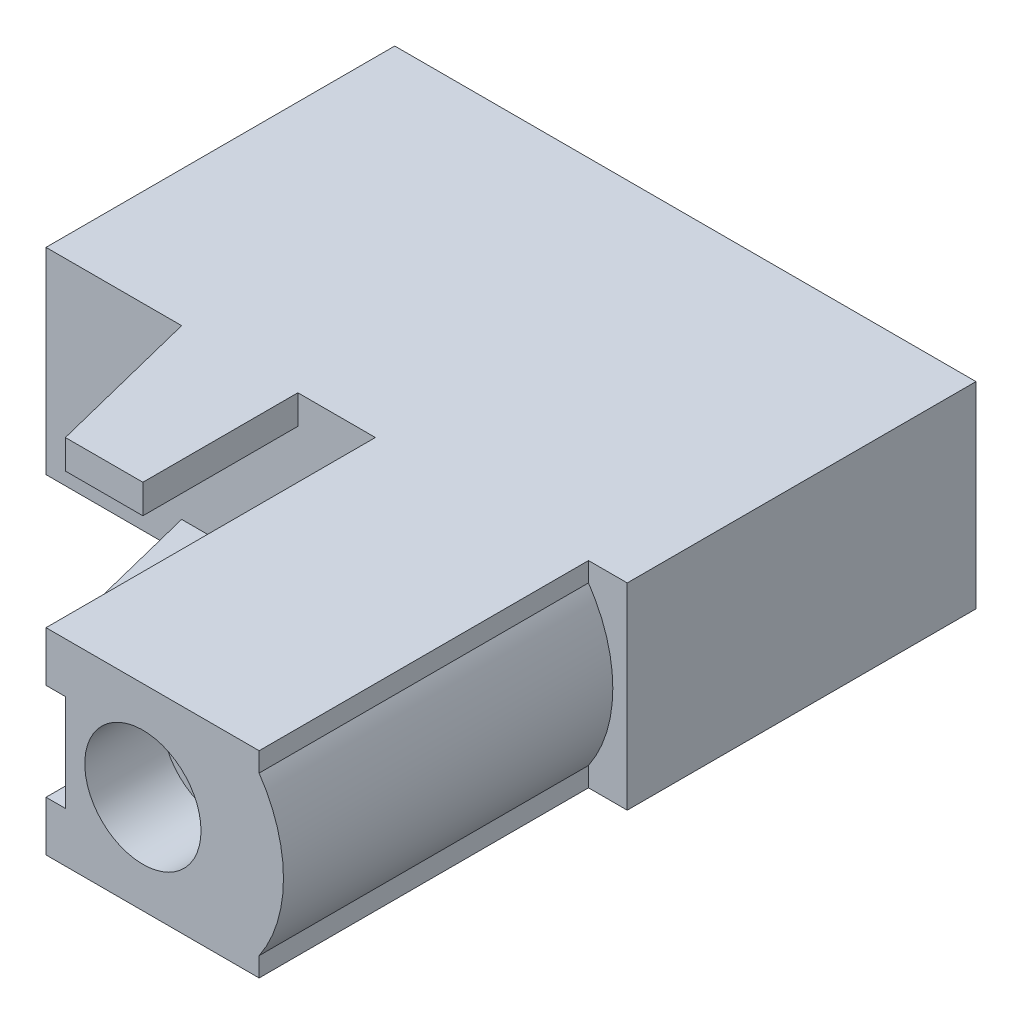
ISO-10303-21;
HEADER;
FILE_DESCRIPTION(('STEP AP214'),'2;1');
FILE_NAME('part.step','',(''),(''),'','','');
FILE_SCHEMA(('AUTOMOTIVE_DESIGN { 1 0 10303 214 1 1 1 1 }'));
ENDSEC;
DATA;
#1=APPLICATION_CONTEXT('core data for automotive mechanical design processes');
#2=APPLICATION_PROTOCOL_DEFINITION('international standard','automotive_design',2000,#1);
#3=PRODUCT_CONTEXT('',#1,'mechanical');
#4=PRODUCT('Part','Part','',(#3));
#5=PRODUCT_RELATED_PRODUCT_CATEGORY('part','',(#4));
#6=PRODUCT_DEFINITION_FORMATION('','',#4);
#7=PRODUCT_DEFINITION_CONTEXT('part definition',#1,'design');
#8=PRODUCT_DEFINITION('design','',#6,#7);
#9=PRODUCT_DEFINITION_SHAPE('','',#8);
#10=(LENGTH_UNIT() NAMED_UNIT(*) SI_UNIT(.MILLI.,.METRE.));
#11=(NAMED_UNIT(*) PLANE_ANGLE_UNIT() SI_UNIT($,.RADIAN.));
#12=(NAMED_UNIT(*) SI_UNIT($,.STERADIAN.) SOLID_ANGLE_UNIT());
#13=UNCERTAINTY_MEASURE_WITH_UNIT(LENGTH_MEASURE(1.E-05),#10,'distance_accuracy_value','');
#14=(GEOMETRIC_REPRESENTATION_CONTEXT(3) GLOBAL_UNCERTAINTY_ASSIGNED_CONTEXT((#13)) GLOBAL_UNIT_ASSIGNED_CONTEXT((#10,
#11,#12)) REPRESENTATION_CONTEXT('',''));
#15=CARTESIAN_POINT('',(0.,0.,0.));
#16=DIRECTION('',(0.,0.,1.));
#17=DIRECTION('',(1.,0.,0.));
#18=AXIS2_PLACEMENT_3D('',#15,#16,#17);
#19=CARTESIAN_POINT('',(0.,0.,9.));
#20=DIRECTION('',(0.,0.,1.));
#21=DIRECTION('',(1.,0.,0.));
#22=AXIS2_PLACEMENT_3D('',#19,#20,#21);
#23=PLANE('',#22);
#24=DIRECTION('',(-1.,0.,0.));
#25=VECTOR('',#24,1.);
#26=CARTESIAN_POINT('',(-7.5,2.54,9.));
#27=LINE('',#26,#25);
#28=CARTESIAN_POINT('',(0.999999999999992,2.54,9.));
#29=VERTEX_POINT('',#28);
#30=CARTESIAN_POINT('',(-1.,2.54,9.));
#31=VERTEX_POINT('',#30);
#32=EDGE_CURVE('E346',#29,#31,#27,.T.);
#33=ORIENTED_EDGE('',*,*,#32,.T.);
#34=DIRECTION('',(0.,-1.,0.));
#35=VECTOR('',#34,1.);
#36=CARTESIAN_POINT('',(-1.,0.,9.));
#37=LINE('',#36,#35);
#38=CARTESIAN_POINT('',(-1.,1.79,9.));
#39=VERTEX_POINT('',#38);
#40=EDGE_CURVE('E52',#31,#39,#37,.T.);
#41=ORIENTED_EDGE('',*,*,#40,.T.);
#42=DIRECTION('',(1.,0.,0.));
#43=VECTOR('',#42,1.);
#44=CARTESIAN_POINT('',(0.,1.79,9.));
#45=LINE('',#44,#43);
#46=CARTESIAN_POINT('',(-4.,1.79,9.));
#47=VERTEX_POINT('',#46);
#48=EDGE_CURVE('E12',#47,#39,#45,.T.);
#49=ORIENTED_EDGE('',*,*,#48,.F.);
#50=DIRECTION('',(0.,1.,0.));
#51=VECTOR('',#50,1.);
#52=CARTESIAN_POINT('',(-4.,1.79,9.));
#53=LINE('',#52,#51);
#54=CARTESIAN_POINT('',(-4.,2.54,9.));
#55=VERTEX_POINT('',#54);
#56=EDGE_CURVE('E193',#47,#55,#53,.T.);
#57=ORIENTED_EDGE('',*,*,#56,.T.);
#58=CARTESIAN_POINT('',(-7.5,2.54,9.));
#59=VERTEX_POINT('',#58);
#60=EDGE_CURVE('E351',#55,#59,#27,.T.);
#61=ORIENTED_EDGE('',*,*,#60,.T.);
#62=DIRECTION('',(0.,-1.,0.));
#63=VECTOR('',#62,1.);
#64=CARTESIAN_POINT('',(-7.5,2.54,9.));
#65=LINE('',#64,#63);
#66=CARTESIAN_POINT('',(-7.5,-2.54,9.));
#67=VERTEX_POINT('',#66);
#68=EDGE_CURVE('E310',#59,#67,#65,.T.);
#69=ORIENTED_EDGE('',*,*,#68,.T.);
#70=DIRECTION('',(1.,0.,0.));
#71=VECTOR('',#70,1.);
#72=CARTESIAN_POINT('',(-7.5,-2.54,9.));
#73=LINE('',#72,#71);
#74=CARTESIAN_POINT('',(-4.,-2.54,9.));
#75=VERTEX_POINT('',#74);
#76=EDGE_CURVE('E305',#67,#75,#73,.T.);
#77=ORIENTED_EDGE('',*,*,#76,.T.);
#78=DIRECTION('',(0.,-1.,0.));
#79=VECTOR('',#78,1.);
#80=CARTESIAN_POINT('',(-4.,-1.79,9.));
#81=LINE('',#80,#79);
#82=CARTESIAN_POINT('',(-4.,-1.79,9.));
#83=VERTEX_POINT('',#82);
#84=EDGE_CURVE('E234',#83,#75,#81,.T.);
#85=ORIENTED_EDGE('',*,*,#84,.F.);
#86=DIRECTION('',(-1.,0.,0.));
#87=VECTOR('',#86,1.);
#88=CARTESIAN_POINT('',(0.,-1.79,9.));
#89=LINE('',#88,#87);
#90=CARTESIAN_POINT('',(-1.,-1.79,9.));
#91=VERTEX_POINT('',#90);
#92=EDGE_CURVE('E45',#91,#83,#89,.T.);
#93=ORIENTED_EDGE('',*,*,#92,.F.);
#94=DIRECTION('',(0.,1.,0.));
#95=VECTOR('',#94,1.);
#96=CARTESIAN_POINT('',(-1.,0.,9.));
#97=LINE('',#96,#95);
#98=CARTESIAN_POINT('',(-1.,-2.54,9.));
#99=VERTEX_POINT('',#98);
#100=EDGE_CURVE('E237',#99,#91,#97,.T.);
#101=ORIENTED_EDGE('',*,*,#100,.F.);
#102=CARTESIAN_POINT('',(0.999999999999992,-2.54,9.));
#103=VERTEX_POINT('',#102);
#104=EDGE_CURVE('E302',#99,#103,#73,.T.);
#105=ORIENTED_EDGE('',*,*,#104,.T.);
#106=DIRECTION('',(0.,-1.,0.));
#107=VECTOR('',#106,1.);
#108=CARTESIAN_POINT('',(0.999999999999999,-2.54,9.));
#109=LINE('',#108,#107);
#110=CARTESIAN_POINT('',(0.999999999999999,-1.25,9.));
#111=VERTEX_POINT('',#110);
#112=EDGE_CURVE('E395',#111,#103,#109,.T.);
#113=ORIENTED_EDGE('',*,*,#112,.F.);
#114=DIRECTION('',(-1.,0.,0.));
#115=VECTOR('',#114,1.);
#116=CARTESIAN_POINT('',(1.5,-1.25,9.));
#117=LINE('',#116,#115);
#118=CARTESIAN_POINT('',(1.5,-1.25,9.));
#119=VERTEX_POINT('',#118);
#120=EDGE_CURVE('E401',#119,#111,#117,.T.);
#121=ORIENTED_EDGE('',*,*,#120,.F.);
#122=DIRECTION('',(0.,-1.,0.));
#123=VECTOR('',#122,1.);
#124=CARTESIAN_POINT('',(1.5,1.25,9.));
#125=LINE('',#124,#123);
#126=CARTESIAN_POINT('',(1.5,1.25,9.));
#127=VERTEX_POINT('',#126);
#128=EDGE_CURVE('E723',#127,#119,#125,.T.);
#129=ORIENTED_EDGE('',*,*,#128,.F.);
#130=DIRECTION('',(1.,0.,0.));
#131=VECTOR('',#130,1.);
#132=CARTESIAN_POINT('',(1.5,1.25,9.));
#133=LINE('',#132,#131);
#134=CARTESIAN_POINT('',(1.,1.25,9.));
#135=VERTEX_POINT('',#134);
#136=EDGE_CURVE('E291',#135,#127,#133,.T.);
#137=ORIENTED_EDGE('',*,*,#136,.F.);
#138=DIRECTION('',(0.,-1.,0.));
#139=VECTOR('',#138,1.);
#140=CARTESIAN_POINT('',(1.,1.25,9.));
#141=LINE('',#140,#139);
#142=EDGE_CURVE('E297',#29,#135,#141,.T.);
#143=ORIENTED_EDGE('',*,*,#142,.F.);
#144=EDGE_LOOP('',(#33,#41,#49,#57,#61,#69,#77,#85,#93,#101,#105,#113,#121,#129,#137,#143));
#145=FACE_BOUND('',#144,.T.);
#146=ADVANCED_FACE('F37',(#145),#23,.T.);
#147=CARTESIAN_POINT('',(-7.5,2.54,9.));
#148=DIRECTION('',(1.,0.,0.));
#149=DIRECTION('',(0.,0.,-1.));
#150=AXIS2_PLACEMENT_3D('',#147,#148,#149);
#151=PLANE('',#150);
#152=DIRECTION('',(0.,-1.,0.));
#153=VECTOR('',#152,1.);
#154=CARTESIAN_POINT('',(-7.5,2.54,0.));
#155=LINE('',#154,#153);
#156=CARTESIAN_POINT('',(-7.5,2.54,0.));
#157=VERTEX_POINT('',#156);
#158=CARTESIAN_POINT('',(-7.5,-2.54,0.));
#159=VERTEX_POINT('',#158);
#160=EDGE_CURVE('E339',#157,#159,#155,.T.);
#161=ORIENTED_EDGE('',*,*,#160,.T.);
#162=DIRECTION('',(0.,0.,-1.));
#163=VECTOR('',#162,1.);
#164=CARTESIAN_POINT('',(-7.5,-2.54,9.));
#165=LINE('',#164,#163);
#166=EDGE_CURVE('E320',#67,#159,#165,.T.);
#167=ORIENTED_EDGE('',*,*,#166,.F.);
#168=ORIENTED_EDGE('',*,*,#68,.F.);
#169=DIRECTION('',(0.,0.,-1.));
#170=VECTOR('',#169,1.);
#171=CARTESIAN_POINT('',(-7.5,2.54,9.));
#172=LINE('',#171,#170);
#173=EDGE_CURVE('E329',#59,#157,#172,.T.);
#174=ORIENTED_EDGE('',*,*,#173,.T.);
#175=EDGE_LOOP('',(#161,#167,#168,#174));
#176=FACE_BOUND('',#175,.T.);
#177=ADVANCED_FACE('F39',(#176),#151,.F.);
#178=CARTESIAN_POINT('',(-7.5,-2.54,9.));
#179=DIRECTION('',(0.,1.,0.));
#180=DIRECTION('',(-1.,0.,0.));
#181=AXIS2_PLACEMENT_3D('',#178,#179,#180);
#182=PLANE('',#181);
#183=ORIENTED_EDGE('',*,*,#104,.F.);
#184=DIRECTION('',(0.,0.,1.));
#185=VECTOR('',#184,1.);
#186=CARTESIAN_POINT('',(-1.,-2.54,13.));
#187=LINE('',#186,#185);
#188=CARTESIAN_POINT('',(-1.,-2.54,13.));
#189=VERTEX_POINT('',#188);
#190=EDGE_CURVE('E217',#99,#189,#187,.T.);
#191=ORIENTED_EDGE('',*,*,#190,.T.);
#192=DIRECTION('',(-1.,0.,0.));
#193=VECTOR('',#192,1.);
#194=CARTESIAN_POINT('',(-3.,-2.54,13.));
#195=LINE('',#194,#193);
#196=CARTESIAN_POINT('',(-3.,-2.54,13.));
#197=VERTEX_POINT('',#196);
#198=EDGE_CURVE('E229',#189,#197,#195,.T.);
#199=ORIENTED_EDGE('',*,*,#198,.T.);
#200=DIRECTION('',(-0.242535625036333,0.,-0.970142500145332));
#201=VECTOR('',#200,1.);
#202=CARTESIAN_POINT('',(-4.,-2.54,9.));
#203=LINE('',#202,#201);
#204=EDGE_CURVE('E221',#197,#75,#203,.T.);
#205=ORIENTED_EDGE('',*,*,#204,.T.);
#206=ORIENTED_EDGE('',*,*,#76,.F.);
#207=ORIENTED_EDGE('',*,*,#166,.T.);
#208=DIRECTION('',(1.,0.,0.));
#209=VECTOR('',#208,1.);
#210=CARTESIAN_POINT('',(-7.5,-2.54,0.));
#211=LINE('',#210,#209);
#212=CARTESIAN_POINT('',(7.5,-2.54,0.));
#213=VERTEX_POINT('',#212);
#214=EDGE_CURVE('E337',#159,#213,#211,.T.);
#215=ORIENTED_EDGE('',*,*,#214,.T.);
#216=DIRECTION('',(0.,0.,-1.));
#217=VECTOR('',#216,1.);
#218=CARTESIAN_POINT('',(7.5,-2.54,9.));
#219=LINE('',#218,#217);
#220=CARTESIAN_POINT('',(7.5,-2.54,9.));
#221=VERTEX_POINT('',#220);
#222=EDGE_CURVE('E323',#221,#213,#219,.T.);
#223=ORIENTED_EDGE('',*,*,#222,.F.);
#224=CARTESIAN_POINT('',(6.49999999999999,-2.54,9.));
#225=VERTEX_POINT('',#224);
#226=EDGE_CURVE('E306',#225,#221,#73,.T.);
#227=ORIENTED_EDGE('',*,*,#226,.F.);
#228=DIRECTION('',(0.,0.,-1.));
#229=VECTOR('',#228,1.);
#230=CARTESIAN_POINT('',(6.5,-2.54,42.9597399297588));
#231=LINE('',#230,#229);
#232=CARTESIAN_POINT('',(6.5,-2.54,17.5));
#233=VERTEX_POINT('',#232);
#234=EDGE_CURVE('E341',#233,#225,#231,.T.);
#235=ORIENTED_EDGE('',*,*,#234,.F.);
#236=DIRECTION('',(1.,0.,0.));
#237=VECTOR('',#236,1.);
#238=CARTESIAN_POINT('',(0.999999999999999,-2.54,17.5));
#239=LINE('',#238,#237);
#240=CARTESIAN_POINT('',(0.999999999999999,-2.54,17.5));
#241=VERTEX_POINT('',#240);
#242=EDGE_CURVE('E278',#241,#233,#239,.T.);
#243=ORIENTED_EDGE('',*,*,#242,.F.);
#244=DIRECTION('',(0.,0.,-1.));
#245=VECTOR('',#244,1.);
#246=CARTESIAN_POINT('',(0.999999999999999,-2.54,42.9597399297588));
#247=LINE('',#246,#245);
#248=EDGE_CURVE('E391',#241,#103,#247,.T.);
#249=ORIENTED_EDGE('',*,*,#248,.T.);
#250=EDGE_LOOP('',(#183,#191,#199,#205,#206,#207,#215,#223,#227,#235,#243,#249));
#251=FACE_BOUND('',#250,.T.);
#252=ADVANCED_FACE('F433',(#251),#182,.F.);
#253=CARTESIAN_POINT('',(7.5,2.54,9.));
#254=DIRECTION('',(-1.,0.,0.));
#255=DIRECTION('',(0.,0.,1.));
#256=AXIS2_PLACEMENT_3D('',#253,#254,#255);
#257=PLANE('',#256);
#258=DIRECTION('',(0.,1.,0.));
#259=VECTOR('',#258,1.);
#260=CARTESIAN_POINT('',(7.5,2.54,0.));
#261=LINE('',#260,#259);
#262=CARTESIAN_POINT('',(7.5,2.54,0.));
#263=VERTEX_POINT('',#262);
#264=EDGE_CURVE('E335',#213,#263,#261,.T.);
#265=ORIENTED_EDGE('',*,*,#264,.T.);
#266=DIRECTION('',(0.,0.,-1.));
#267=VECTOR('',#266,1.);
#268=CARTESIAN_POINT('',(7.5,2.54,9.));
#269=LINE('',#268,#267);
#270=CARTESIAN_POINT('',(7.5,2.54,9.));
#271=VERTEX_POINT('',#270);
#272=EDGE_CURVE('E326',#271,#263,#269,.T.);
#273=ORIENTED_EDGE('',*,*,#272,.F.);
#274=DIRECTION('',(0.,1.,0.));
#275=VECTOR('',#274,1.);
#276=CARTESIAN_POINT('',(7.5,2.54,9.));
#277=LINE('',#276,#275);
#278=EDGE_CURVE('E312',#221,#271,#277,.T.);
#279=ORIENTED_EDGE('',*,*,#278,.F.);
#280=ORIENTED_EDGE('',*,*,#222,.T.);
#281=EDGE_LOOP('',(#265,#273,#279,#280));
#282=FACE_BOUND('',#281,.T.);
#283=ADVANCED_FACE('F361',(#282),#257,.F.);
#284=CARTESIAN_POINT('',(-7.5,2.54,9.));
#285=DIRECTION('',(0.,-1.,0.));
#286=DIRECTION('',(1.,0.,0.));
#287=AXIS2_PLACEMENT_3D('',#284,#285,#286);
#288=PLANE('',#287);
#289=ORIENTED_EDGE('',*,*,#60,.F.);
#290=DIRECTION('',(-0.242535625036333,0.,-0.970142500145332));
#291=VECTOR('',#290,1.);
#292=CARTESIAN_POINT('',(-4.,2.54,9.));
#293=LINE('',#292,#291);
#294=CARTESIAN_POINT('',(-3.,2.54,13.));
#295=VERTEX_POINT('',#294);
#296=EDGE_CURVE('E210',#295,#55,#293,.T.);
#297=ORIENTED_EDGE('',*,*,#296,.F.);
#298=DIRECTION('',(-1.,0.,0.));
#299=VECTOR('',#298,1.);
#300=CARTESIAN_POINT('',(-3.,2.54,13.));
#301=LINE('',#300,#299);
#302=CARTESIAN_POINT('',(-1.,2.54,13.));
#303=VERTEX_POINT('',#302);
#304=EDGE_CURVE('E199',#303,#295,#301,.T.);
#305=ORIENTED_EDGE('',*,*,#304,.F.);
#306=DIRECTION('',(0.,0.,1.));
#307=VECTOR('',#306,1.);
#308=CARTESIAN_POINT('',(-1.,2.54,13.));
#309=LINE('',#308,#307);
#310=EDGE_CURVE('E207',#31,#303,#309,.T.);
#311=ORIENTED_EDGE('',*,*,#310,.F.);
#312=ORIENTED_EDGE('',*,*,#32,.F.);
#313=DIRECTION('',(0.,0.,-1.));
#314=VECTOR('',#313,1.);
#315=CARTESIAN_POINT('',(0.999999999999999,2.54,42.9597399297588));
#316=LINE('',#315,#314);
#317=CARTESIAN_POINT('',(0.999999999999999,2.54,17.5));
#318=VERTEX_POINT('',#317);
#319=EDGE_CURVE('E371',#318,#29,#316,.T.);
#320=ORIENTED_EDGE('',*,*,#319,.F.);
#321=DIRECTION('',(-1.,0.,0.));
#322=VECTOR('',#321,1.);
#323=CARTESIAN_POINT('',(0.999999999999999,2.54,17.5));
#324=LINE('',#323,#322);
#325=CARTESIAN_POINT('',(6.5,2.54,17.5));
#326=VERTEX_POINT('',#325);
#327=EDGE_CURVE('E266',#326,#318,#324,.T.);
#328=ORIENTED_EDGE('',*,*,#327,.F.);
#329=DIRECTION('',(0.,0.,-1.));
#330=VECTOR('',#329,1.);
#331=CARTESIAN_POINT('',(6.5,2.54,42.9597399297588));
#332=LINE('',#331,#330);
#333=CARTESIAN_POINT('',(6.49999999999999,2.54,9.));
#334=VERTEX_POINT('',#333);
#335=EDGE_CURVE('E367',#326,#334,#332,.T.);
#336=ORIENTED_EDGE('',*,*,#335,.T.);
#337=EDGE_CURVE('E332',#271,#334,#27,.T.);
#338=ORIENTED_EDGE('',*,*,#337,.F.);
#339=ORIENTED_EDGE('',*,*,#272,.T.);
#340=DIRECTION('',(-1.,0.,0.));
#341=VECTOR('',#340,1.);
#342=CARTESIAN_POINT('',(-7.5,2.54,0.));
#343=LINE('',#342,#341);
#344=EDGE_CURVE('E333',#263,#157,#343,.T.);
#345=ORIENTED_EDGE('',*,*,#344,.T.);
#346=ORIENTED_EDGE('',*,*,#173,.F.);
#347=EDGE_LOOP('',(#289,#297,#305,#311,#312,#320,#328,#336,#338,#339,#345,#346));
#348=FACE_BOUND('',#347,.T.);
#349=ADVANCED_FACE('F365',(#348),#288,.F.);
#350=DIRECTION('',(0.,1.,0.));
#351=VECTOR('',#350,1.);
#352=CARTESIAN_POINT('',(6.5,2.54,9.));
#353=LINE('',#352,#351);
#354=CARTESIAN_POINT('',(6.5,2.04,9.));
#355=VERTEX_POINT('',#354);
#356=EDGE_CURVE('E288',#355,#334,#353,.T.);
#357=ORIENTED_EDGE('',*,*,#356,.F.);
#358=CARTESIAN_POINT('',(3.5,0.,9.));
#359=DIRECTION('',(0.,0.,1.));
#360=DIRECTION('',(-1.,0.,0.));
#361=AXIS2_PLACEMENT_3D('',#358,#359,#360);
#362=CIRCLE('',#361,3.62789194987944);
#363=CARTESIAN_POINT('',(6.5,-2.04,9.));
#364=VERTEX_POINT('',#363);
#365=EDGE_CURVE('E285',#364,#355,#362,.T.);
#366=ORIENTED_EDGE('',*,*,#365,.F.);
#367=DIRECTION('',(0.,1.,0.));
#368=VECTOR('',#367,1.);
#369=CARTESIAN_POINT('',(6.5,-2.54,9.));
#370=LINE('',#369,#368);
#371=EDGE_CURVE('E284',#225,#364,#370,.T.);
#372=ORIENTED_EDGE('',*,*,#371,.F.);
#373=ORIENTED_EDGE('',*,*,#226,.T.);
#374=ORIENTED_EDGE('',*,*,#278,.T.);
#375=ORIENTED_EDGE('',*,*,#337,.T.);
#376=EDGE_LOOP('',(#357,#366,#372,#373,#374,#375));
#377=FACE_BOUND('',#376,.T.);
#378=ADVANCED_FACE('F357',(#377),#23,.T.);
#379=CARTESIAN_POINT('',(0.,0.,0.));
#380=DIRECTION('',(0.,0.,1.));
#381=DIRECTION('',(1.,0.,0.));
#382=AXIS2_PLACEMENT_3D('',#379,#380,#381);
#383=PLANE('',#382);
#384=ORIENTED_EDGE('',*,*,#160,.F.);
#385=ORIENTED_EDGE('',*,*,#344,.F.);
#386=ORIENTED_EDGE('',*,*,#264,.F.);
#387=ORIENTED_EDGE('',*,*,#214,.F.);
#388=EDGE_LOOP('',(#384,#385,#386,#387));
#389=FACE_BOUND('',#388,.T.);
#390=ADVANCED_FACE('F476',(#389),#383,.F.);
#391=CARTESIAN_POINT('',(0.999999999999999,-2.54,42.9597399297588));
#392=DIRECTION('',(1.,0.,0.));
#393=DIRECTION('',(0.,0.,-1.));
#394=AXIS2_PLACEMENT_3D('',#391,#392,#393);
#395=PLANE('',#394);
#396=DIRECTION('',(0.,-1.,0.));
#397=VECTOR('',#396,1.);
#398=CARTESIAN_POINT('',(0.999999999999999,-2.54,17.5));
#399=LINE('',#398,#397);
#400=CARTESIAN_POINT('',(0.999999999999999,-1.25,17.5));
#401=VERTEX_POINT('',#400);
#402=EDGE_CURVE('E251',#401,#241,#399,.T.);
#403=ORIENTED_EDGE('',*,*,#402,.F.);
#404=DIRECTION('',(0.,0.,-1.));
#405=VECTOR('',#404,1.);
#406=CARTESIAN_POINT('',(0.999999999999999,-1.25,42.9597399297588));
#407=LINE('',#406,#405);
#408=EDGE_CURVE('E394',#401,#111,#407,.T.);
#409=ORIENTED_EDGE('',*,*,#408,.T.);
#410=ORIENTED_EDGE('',*,*,#112,.T.);
#411=ORIENTED_EDGE('',*,*,#248,.F.);
#412=EDGE_LOOP('',(#403,#409,#410,#411));
#413=FACE_BOUND('',#412,.T.);
#414=ADVANCED_FACE('F481',(#413),#395,.F.);
#415=CARTESIAN_POINT('',(1.5,-1.25,42.9597399297588));
#416=DIRECTION('',(0.,-1.,0.));
#417=DIRECTION('',(1.,0.,0.));
#418=AXIS2_PLACEMENT_3D('',#415,#416,#417);
#419=PLANE('',#418);
#420=DIRECTION('',(-1.,0.,0.));
#421=VECTOR('',#420,1.);
#422=CARTESIAN_POINT('',(1.5,-1.25,17.5));
#423=LINE('',#422,#421);
#424=CARTESIAN_POINT('',(1.5,-1.25,17.5));
#425=VERTEX_POINT('',#424);
#426=EDGE_CURVE('E254',#425,#401,#423,.T.);
#427=ORIENTED_EDGE('',*,*,#426,.F.);
#428=DIRECTION('',(0.,0.,-1.));
#429=VECTOR('',#428,1.);
#430=CARTESIAN_POINT('',(1.5,-1.25,42.9597399297588));
#431=LINE('',#430,#429);
#432=EDGE_CURVE('E408',#425,#119,#431,.T.);
#433=ORIENTED_EDGE('',*,*,#432,.T.);
#434=ORIENTED_EDGE('',*,*,#120,.T.);
#435=ORIENTED_EDGE('',*,*,#408,.F.);
#436=EDGE_LOOP('',(#427,#433,#434,#435));
#437=FACE_BOUND('',#436,.T.);
#438=ADVANCED_FACE('F523',(#437),#419,.F.);
#439=CARTESIAN_POINT('',(1.5,1.25,42.9597399297588));
#440=DIRECTION('',(1.,0.,0.));
#441=DIRECTION('',(0.,1.,0.));
#442=AXIS2_PLACEMENT_3D('',#439,#440,#441);
#443=PLANE('',#442);
#444=DIRECTION('',(0.,-1.,0.));
#445=VECTOR('',#444,1.);
#446=CARTESIAN_POINT('',(1.5,1.25,17.5));
#447=LINE('',#446,#445);
#448=CARTESIAN_POINT('',(1.5,1.25,17.5));
#449=VERTEX_POINT('',#448);
#450=EDGE_CURVE('E257',#449,#425,#447,.T.);
#451=ORIENTED_EDGE('',*,*,#450,.F.);
#452=DIRECTION('',(0.,0.,-1.));
#453=VECTOR('',#452,1.);
#454=CARTESIAN_POINT('',(1.5,1.25,42.9597399297588));
#455=LINE('',#454,#453);
#456=EDGE_CURVE('E411',#449,#127,#455,.T.);
#457=ORIENTED_EDGE('',*,*,#456,.T.);
#458=ORIENTED_EDGE('',*,*,#128,.T.);
#459=ORIENTED_EDGE('',*,*,#432,.F.);
#460=EDGE_LOOP('',(#451,#457,#458,#459));
#461=FACE_BOUND('',#460,.T.);
#462=ADVANCED_FACE('F534',(#461),#443,.F.);
#463=CARTESIAN_POINT('',(1.5,1.25,42.9597399297588));
#464=DIRECTION('',(0.,1.,0.));
#465=DIRECTION('',(-1.,0.,0.));
#466=AXIS2_PLACEMENT_3D('',#463,#464,#465);
#467=PLANE('',#466);
#468=DIRECTION('',(1.,0.,0.));
#469=VECTOR('',#468,1.);
#470=CARTESIAN_POINT('',(1.5,1.25,17.5));
#471=LINE('',#470,#469);
#472=CARTESIAN_POINT('',(1.,1.25,17.5));
#473=VERTEX_POINT('',#472);
#474=EDGE_CURVE('E260',#473,#449,#471,.T.);
#475=ORIENTED_EDGE('',*,*,#474,.F.);
#476=DIRECTION('',(0.,0.,-1.));
#477=VECTOR('',#476,1.);
#478=CARTESIAN_POINT('',(1.,1.25,42.9597399297588));
#479=LINE('',#478,#477);
#480=EDGE_CURVE('E414',#473,#135,#479,.T.);
#481=ORIENTED_EDGE('',*,*,#480,.T.);
#482=ORIENTED_EDGE('',*,*,#136,.T.);
#483=ORIENTED_EDGE('',*,*,#456,.F.);
#484=EDGE_LOOP('',(#475,#481,#482,#483));
#485=FACE_BOUND('',#484,.T.);
#486=ADVANCED_FACE('F544',(#485),#467,.F.);
#487=CARTESIAN_POINT('',(1.,1.25,42.9597399297588));
#488=DIRECTION('',(1.,0.,0.));
#489=DIRECTION('',(0.,1.,0.));
#490=AXIS2_PLACEMENT_3D('',#487,#488,#489);
#491=PLANE('',#490);
#492=DIRECTION('',(0.,-1.,0.));
#493=VECTOR('',#492,1.);
#494=CARTESIAN_POINT('',(1.,1.25,17.5));
#495=LINE('',#494,#493);
#496=EDGE_CURVE('E263',#318,#473,#495,.T.);
#497=ORIENTED_EDGE('',*,*,#496,.F.);
#498=ORIENTED_EDGE('',*,*,#319,.T.);
#499=ORIENTED_EDGE('',*,*,#142,.T.);
#500=ORIENTED_EDGE('',*,*,#480,.F.);
#501=EDGE_LOOP('',(#497,#498,#499,#500));
#502=FACE_BOUND('',#501,.T.);
#503=ADVANCED_FACE('F427',(#502),#491,.F.);
#504=CARTESIAN_POINT('',(6.5,2.54,42.9597399297588));
#505=DIRECTION('',(-1.,0.,0.));
#506=DIRECTION('',(0.,0.,1.));
#507=AXIS2_PLACEMENT_3D('',#504,#505,#506);
#508=PLANE('',#507);
#509=DIRECTION('',(0.,1.,0.));
#510=VECTOR('',#509,1.);
#511=CARTESIAN_POINT('',(6.5,2.54,17.5));
#512=LINE('',#511,#510);
#513=CARTESIAN_POINT('',(6.5,2.04,17.5));
#514=VERTEX_POINT('',#513);
#515=EDGE_CURVE('E269',#514,#326,#512,.T.);
#516=ORIENTED_EDGE('',*,*,#515,.F.);
#517=DIRECTION('',(0.,0.,-1.));
#518=VECTOR('',#517,1.);
#519=CARTESIAN_POINT('',(6.5,2.04,42.9597399297588));
#520=LINE('',#519,#518);
#521=EDGE_CURVE('E370',#514,#355,#520,.T.);
#522=ORIENTED_EDGE('',*,*,#521,.T.);
#523=ORIENTED_EDGE('',*,*,#356,.T.);
#524=ORIENTED_EDGE('',*,*,#335,.F.);
#525=EDGE_LOOP('',(#516,#522,#523,#524));
#526=FACE_BOUND('',#525,.T.);
#527=ADVANCED_FACE('F373',(#526),#508,.F.);
#528=CARTESIAN_POINT('',(3.5,0.,42.9597399297588));
#529=DIRECTION('',(0.,0.,-1.));
#530=DIRECTION('',(-1.,0.,0.));
#531=AXIS2_PLACEMENT_3D('',#528,#529,#530);
#532=CYLINDRICAL_SURFACE('',#531,3.62789194987944);
#533=CARTESIAN_POINT('',(3.5,0.,17.5));
#534=DIRECTION('',(0.,0.,1.));
#535=DIRECTION('',(1.,0.,0.));
#536=AXIS2_PLACEMENT_3D('',#533,#534,#535);
#537=CIRCLE('',#536,3.62789194987944);
#538=CARTESIAN_POINT('',(6.5,-2.04,17.5));
#539=VERTEX_POINT('',#538);
#540=EDGE_CURVE('E272',#539,#514,#537,.T.);
#541=ORIENTED_EDGE('',*,*,#540,.F.);
#542=DIRECTION('',(0.,0.,-1.));
#543=VECTOR('',#542,1.);
#544=CARTESIAN_POINT('',(6.5,-2.04,42.9597399297588));
#545=LINE('',#544,#543);
#546=EDGE_CURVE('E379',#539,#364,#545,.T.);
#547=ORIENTED_EDGE('',*,*,#546,.T.);
#548=ORIENTED_EDGE('',*,*,#365,.T.);
#549=ORIENTED_EDGE('',*,*,#521,.F.);
#550=EDGE_LOOP('',(#541,#547,#548,#549));
#551=FACE_BOUND('',#550,.T.);
#552=ADVANCED_FACE('F380',(#551),#532,.T.);
#553=CARTESIAN_POINT('',(6.5,-2.54,42.9597399297588));
#554=DIRECTION('',(-1.,0.,0.));
#555=DIRECTION('',(0.,0.,1.));
#556=AXIS2_PLACEMENT_3D('',#553,#554,#555);
#557=PLANE('',#556);
#558=DIRECTION('',(0.,1.,0.));
#559=VECTOR('',#558,1.);
#560=CARTESIAN_POINT('',(6.5,-2.54,17.5));
#561=LINE('',#560,#559);
#562=EDGE_CURVE('E275',#233,#539,#561,.T.);
#563=ORIENTED_EDGE('',*,*,#562,.F.);
#564=ORIENTED_EDGE('',*,*,#234,.T.);
#565=ORIENTED_EDGE('',*,*,#371,.T.);
#566=ORIENTED_EDGE('',*,*,#546,.F.);
#567=EDGE_LOOP('',(#563,#564,#565,#566));
#568=FACE_BOUND('',#567,.T.);
#569=ADVANCED_FACE('F383',(#568),#557,.F.);
#570=CARTESIAN_POINT('',(0.,0.,17.5));
#571=DIRECTION('',(0.,0.,1.));
#572=DIRECTION('',(1.,0.,0.));
#573=AXIS2_PLACEMENT_3D('',#570,#571,#572);
#574=PLANE('',#573);
#575=CARTESIAN_POINT('',(3.5,0.,17.5));
#576=DIRECTION('',(0.,0.,1.));
#577=DIRECTION('',(1.,0.,0.));
#578=AXIS2_PLACEMENT_3D('',#575,#576,#577);
#579=CIRCLE('',#578,1.5);
#580=CARTESIAN_POINT('',(5.,0.,17.5));
#581=VERTEX_POINT('',#580);
#582=EDGE_CURVE('E244',#581,#581,#579,.T.);
#583=ORIENTED_EDGE('',*,*,#582,.F.);
#584=EDGE_LOOP('',(#583));
#585=FACE_BOUND('',#584,.T.);
#586=ORIENTED_EDGE('',*,*,#402,.T.);
#587=ORIENTED_EDGE('',*,*,#242,.T.);
#588=ORIENTED_EDGE('',*,*,#562,.T.);
#589=ORIENTED_EDGE('',*,*,#540,.T.);
#590=ORIENTED_EDGE('',*,*,#515,.T.);
#591=ORIENTED_EDGE('',*,*,#327,.T.);
#592=ORIENTED_EDGE('',*,*,#496,.T.);
#593=ORIENTED_EDGE('',*,*,#474,.T.);
#594=ORIENTED_EDGE('',*,*,#450,.T.);
#595=ORIENTED_EDGE('',*,*,#426,.T.);
#596=EDGE_LOOP('',(#586,#587,#588,#589,#590,#591,#592,#593,#594,#595));
#597=FACE_BOUND('',#596,.T.);
#598=ADVANCED_FACE('F430',(#585,#597),#574,.T.);
#599=CARTESIAN_POINT('',(3.5,0.,15.5));
#600=DIRECTION('',(0.,0.,1.));
#601=DIRECTION('',(1.,0.,0.));
#602=AXIS2_PLACEMENT_3D('',#599,#600,#601);
#603=CYLINDRICAL_SURFACE('',#602,1.5);
#604=CARTESIAN_POINT('',(3.5,0.,15.5));
#605=DIRECTION('',(0.,0.,1.));
#606=DIRECTION('',(1.,0.,0.));
#607=AXIS2_PLACEMENT_3D('',#604,#605,#606);
#608=CIRCLE('',#607,1.5);
#609=CARTESIAN_POINT('',(5.,0.,15.5));
#610=VERTEX_POINT('',#609);
#611=EDGE_CURVE('E245',#610,#610,#608,.T.);
#612=ORIENTED_EDGE('',*,*,#611,.F.);
#613=EDGE_LOOP('',(#612));
#614=FACE_BOUND('',#613,.T.);
#615=ORIENTED_EDGE('',*,*,#582,.T.);
#616=EDGE_LOOP('',(#615));
#617=FACE_BOUND('',#616,.T.);
#618=ADVANCED_FACE('F601',(#614,#617),#603,.F.);
#619=CARTESIAN_POINT('',(3.5,0.,15.5));
#620=DIRECTION('',(0.,0.,1.));
#621=DIRECTION('',(1.,0.,0.));
#622=AXIS2_PLACEMENT_3D('',#619,#620,#621);
#623=PLANE('',#622);
#624=CARTESIAN_POINT('',(3.5,0.,15.5));
#625=DIRECTION('',(0.,0.,1.));
#626=DIRECTION('',(1.,0.,0.));
#627=AXIS2_PLACEMENT_3D('',#624,#625,#626);
#628=CIRCLE('',#627,0.749999999999999);
#629=CARTESIAN_POINT('',(4.25,0.,15.5));
#630=VERTEX_POINT('',#629);
#631=EDGE_CURVE('E248',#630,#630,#628,.T.);
#632=ORIENTED_EDGE('',*,*,#631,.F.);
#633=EDGE_LOOP('',(#632));
#634=FACE_BOUND('',#633,.T.);
#635=ORIENTED_EDGE('',*,*,#611,.T.);
#636=EDGE_LOOP('',(#635));
#637=FACE_BOUND('',#636,.T.);
#638=ADVANCED_FACE('F473',(#634,#637),#623,.T.);
#639=CARTESIAN_POINT('',(3.5,0.,9.));
#640=DIRECTION('',(0.,0.,1.));
#641=DIRECTION('',(1.,0.,0.));
#642=AXIS2_PLACEMENT_3D('',#639,#640,#641);
#643=CIRCLE('',#642,0.749999999999999);
#644=CARTESIAN_POINT('',(4.25,0.,9.));
#645=VERTEX_POINT('',#644);
#646=EDGE_CURVE('E281',#645,#645,#643,.T.);
#647=ORIENTED_EDGE('',*,*,#646,.T.);
#648=EDGE_LOOP('',(#647));
#649=FACE_BOUND('',#648,.T.);
#650=ADVANCED_FACE('F466',(#649),#23,.T.);
#651=CARTESIAN_POINT('',(3.5,0.,42.9597399297588));
#652=DIRECTION('',(0.,0.,-1.));
#653=DIRECTION('',(-1.,0.,0.));
#654=AXIS2_PLACEMENT_3D('',#651,#652,#653);
#655=CYLINDRICAL_SURFACE('',#654,0.749999999999999);
#656=ORIENTED_EDGE('',*,*,#646,.F.);
#657=EDGE_LOOP('',(#656));
#658=FACE_BOUND('',#657,.T.);
#659=ORIENTED_EDGE('',*,*,#631,.T.);
#660=EDGE_LOOP('',(#659));
#661=FACE_BOUND('',#660,.T.);
#662=ADVANCED_FACE('F462',(#658,#661),#655,.F.);
#663=CARTESIAN_POINT('',(-4.,-1.79,9.));
#664=DIRECTION('',(-0.970142500145332,0.,0.242535625036333));
#665=DIRECTION('',(0.242535625036333,0.,0.970142500145332));
#666=AXIS2_PLACEMENT_3D('',#663,#664,#665);
#667=PLANE('',#666);
#668=ORIENTED_EDGE('',*,*,#204,.F.);
#669=DIRECTION('',(0.,-1.,0.));
#670=VECTOR('',#669,1.);
#671=CARTESIAN_POINT('',(-3.,-1.79,13.));
#672=LINE('',#671,#670);
#673=CARTESIAN_POINT('',(-3.,-1.79,13.));
#674=VERTEX_POINT('',#673);
#675=EDGE_CURVE('E238',#674,#197,#672,.T.);
#676=ORIENTED_EDGE('',*,*,#675,.F.);
#677=DIRECTION('',(-0.242535625036333,0.,-0.970142500145332));
#678=VECTOR('',#677,1.);
#679=CARTESIAN_POINT('',(-4.,-1.79,9.));
#680=LINE('',#679,#678);
#681=EDGE_CURVE('E224',#674,#83,#680,.T.);
#682=ORIENTED_EDGE('',*,*,#681,.T.);
#683=ORIENTED_EDGE('',*,*,#84,.T.);
#684=EDGE_LOOP('',(#668,#676,#682,#683));
#685=FACE_BOUND('',#684,.T.);
#686=ADVANCED_FACE('F441',(#685),#667,.T.);
#687=CARTESIAN_POINT('',(-3.,-1.79,13.));
#688=DIRECTION('',(0.,0.,1.));
#689=DIRECTION('',(1.,0.,0.));
#690=AXIS2_PLACEMENT_3D('',#687,#688,#689);
#691=PLANE('',#690);
#692=ORIENTED_EDGE('',*,*,#198,.F.);
#693=DIRECTION('',(0.,-1.,0.));
#694=VECTOR('',#693,1.);
#695=CARTESIAN_POINT('',(-1.,-1.79,13.));
#696=LINE('',#695,#694);
#697=CARTESIAN_POINT('',(-1.,-1.79,13.));
#698=VERTEX_POINT('',#697);
#699=EDGE_CURVE('E227',#698,#189,#696,.T.);
#700=ORIENTED_EDGE('',*,*,#699,.F.);
#701=DIRECTION('',(-1.,0.,0.));
#702=VECTOR('',#701,1.);
#703=CARTESIAN_POINT('',(-3.,-1.79,13.));
#704=LINE('',#703,#702);
#705=EDGE_CURVE('E220',#698,#674,#704,.T.);
#706=ORIENTED_EDGE('',*,*,#705,.T.);
#707=ORIENTED_EDGE('',*,*,#675,.T.);
#708=EDGE_LOOP('',(#692,#700,#706,#707));
#709=FACE_BOUND('',#708,.T.);
#710=ADVANCED_FACE('F454',(#709),#691,.T.);
#711=CARTESIAN_POINT('',(-1.,-1.79,13.));
#712=DIRECTION('',(1.,0.,0.));
#713=DIRECTION('',(0.,1.,0.));
#714=AXIS2_PLACEMENT_3D('',#711,#712,#713);
#715=PLANE('',#714);
#716=ORIENTED_EDGE('',*,*,#190,.F.);
#717=ORIENTED_EDGE('',*,*,#100,.T.);
#718=DIRECTION('',(0.,0.,1.));
#719=VECTOR('',#718,1.);
#720=CARTESIAN_POINT('',(-1.,-1.79,8.30712673711687));
#721=LINE('',#720,#719);
#722=EDGE_CURVE('E218',#91,#698,#721,.T.);
#723=ORIENTED_EDGE('',*,*,#722,.T.);
#724=ORIENTED_EDGE('',*,*,#699,.T.);
#725=EDGE_LOOP('',(#716,#717,#723,#724));
#726=FACE_BOUND('',#725,.T.);
#727=ADVANCED_FACE('F452',(#726),#715,.T.);
#728=CARTESIAN_POINT('',(0.,-1.79,0.));
#729=DIRECTION('',(0.,1.,0.));
#730=DIRECTION('',(-1.,0.,0.));
#731=AXIS2_PLACEMENT_3D('',#728,#729,#730);
#732=PLANE('',#731);
#733=ORIENTED_EDGE('',*,*,#722,.F.);
#734=ORIENTED_EDGE('',*,*,#92,.T.);
#735=ORIENTED_EDGE('',*,*,#681,.F.);
#736=ORIENTED_EDGE('',*,*,#705,.F.);
#737=EDGE_LOOP('',(#733,#734,#735,#736));
#738=FACE_BOUND('',#737,.T.);
#739=ADVANCED_FACE('F447',(#738),#732,.T.);
#740=CARTESIAN_POINT('',(-1.,1.79,13.));
#741=DIRECTION('',(-1.,0.,0.));
#742=DIRECTION('',(0.,-1.,0.));
#743=AXIS2_PLACEMENT_3D('',#740,#741,#742);
#744=PLANE('',#743);
#745=ORIENTED_EDGE('',*,*,#40,.F.);
#746=ORIENTED_EDGE('',*,*,#310,.T.);
#747=DIRECTION('',(0.,1.,0.));
#748=VECTOR('',#747,1.);
#749=CARTESIAN_POINT('',(-1.,1.79,13.));
#750=LINE('',#749,#748);
#751=CARTESIAN_POINT('',(-1.,1.79,13.));
#752=VERTEX_POINT('',#751);
#753=EDGE_CURVE('E203',#752,#303,#750,.T.);
#754=ORIENTED_EDGE('',*,*,#753,.F.);
#755=DIRECTION('',(0.,0.,1.));
#756=VECTOR('',#755,1.);
#757=CARTESIAN_POINT('',(-1.,1.79,8.30712673711687));
#758=LINE('',#757,#756);
#759=EDGE_CURVE('E189',#39,#752,#758,.T.);
#760=ORIENTED_EDGE('',*,*,#759,.F.);
#761=EDGE_LOOP('',(#745,#746,#754,#760));
#762=FACE_BOUND('',#761,.T.);
#763=ADVANCED_FACE('F650',(#762),#744,.F.);
#764=CARTESIAN_POINT('',(-3.,1.79,13.));
#765=DIRECTION('',(0.,0.,-1.));
#766=DIRECTION('',(-1.,0.,0.));
#767=AXIS2_PLACEMENT_3D('',#764,#765,#766);
#768=PLANE('',#767);
#769=ORIENTED_EDGE('',*,*,#304,.T.);
#770=DIRECTION('',(0.,1.,0.));
#771=VECTOR('',#770,1.);
#772=CARTESIAN_POINT('',(-3.,1.79,13.));
#773=LINE('',#772,#771);
#774=CARTESIAN_POINT('',(-3.,1.79,13.));
#775=VERTEX_POINT('',#774);
#776=EDGE_CURVE('E196',#775,#295,#773,.T.);
#777=ORIENTED_EDGE('',*,*,#776,.F.);
#778=DIRECTION('',(-1.,0.,0.));
#779=VECTOR('',#778,1.);
#780=CARTESIAN_POINT('',(-3.,1.79,13.));
#781=LINE('',#780,#779);
#782=EDGE_CURVE('E182',#752,#775,#781,.T.);
#783=ORIENTED_EDGE('',*,*,#782,.F.);
#784=ORIENTED_EDGE('',*,*,#753,.T.);
#785=EDGE_LOOP('',(#769,#777,#783,#784));
#786=FACE_BOUND('',#785,.T.);
#787=ADVANCED_FACE('F197',(#786),#768,.F.);
#788=CARTESIAN_POINT('',(-4.,1.79,9.));
#789=DIRECTION('',(0.970142500145332,0.,-0.242535625036333));
#790=DIRECTION('',(-0.242535625036333,0.,-0.970142500145332));
#791=AXIS2_PLACEMENT_3D('',#788,#789,#790);
#792=PLANE('',#791);
#793=ORIENTED_EDGE('',*,*,#296,.T.);
#794=ORIENTED_EDGE('',*,*,#56,.F.);
#795=DIRECTION('',(-0.242535625036333,0.,-0.970142500145332));
#796=VECTOR('',#795,1.);
#797=CARTESIAN_POINT('',(-4.,1.79,9.));
#798=LINE('',#797,#796);
#799=EDGE_CURVE('E186',#775,#47,#798,.T.);
#800=ORIENTED_EDGE('',*,*,#799,.F.);
#801=ORIENTED_EDGE('',*,*,#776,.T.);
#802=EDGE_LOOP('',(#793,#794,#800,#801));
#803=FACE_BOUND('',#802,.T.);
#804=ADVANCED_FACE('F205',(#803),#792,.F.);
#805=CARTESIAN_POINT('',(0.,1.79,0.));
#806=DIRECTION('',(0.,-1.,0.));
#807=DIRECTION('',(-1.,0.,0.));
#808=AXIS2_PLACEMENT_3D('',#805,#806,#807);
#809=PLANE('',#808);
#810=ORIENTED_EDGE('',*,*,#799,.T.);
#811=ORIENTED_EDGE('',*,*,#48,.T.);
#812=ORIENTED_EDGE('',*,*,#759,.T.);
#813=ORIENTED_EDGE('',*,*,#782,.T.);
#814=EDGE_LOOP('',(#810,#811,#812,#813));
#815=FACE_BOUND('',#814,.T.);
#816=ADVANCED_FACE('F184',(#815),#809,.T.);
#817=CLOSED_SHELL('',(#146,#177,#252,#283,#349,#378,#390,#414,#438,#462,#486,#503,#527,#552,
#569,#598,#618,#638,#650,#662,#686,#710,#727,#739,#763,#787,#804,#816));
#818=MANIFOLD_SOLID_BREP('B2',#817);
#819=ADVANCED_BREP_SHAPE_REPRESENTATION('',(#18,#818),#14);
#820=SHAPE_DEFINITION_REPRESENTATION(#9,#819);
ENDSEC;
END-ISO-10303-21;
